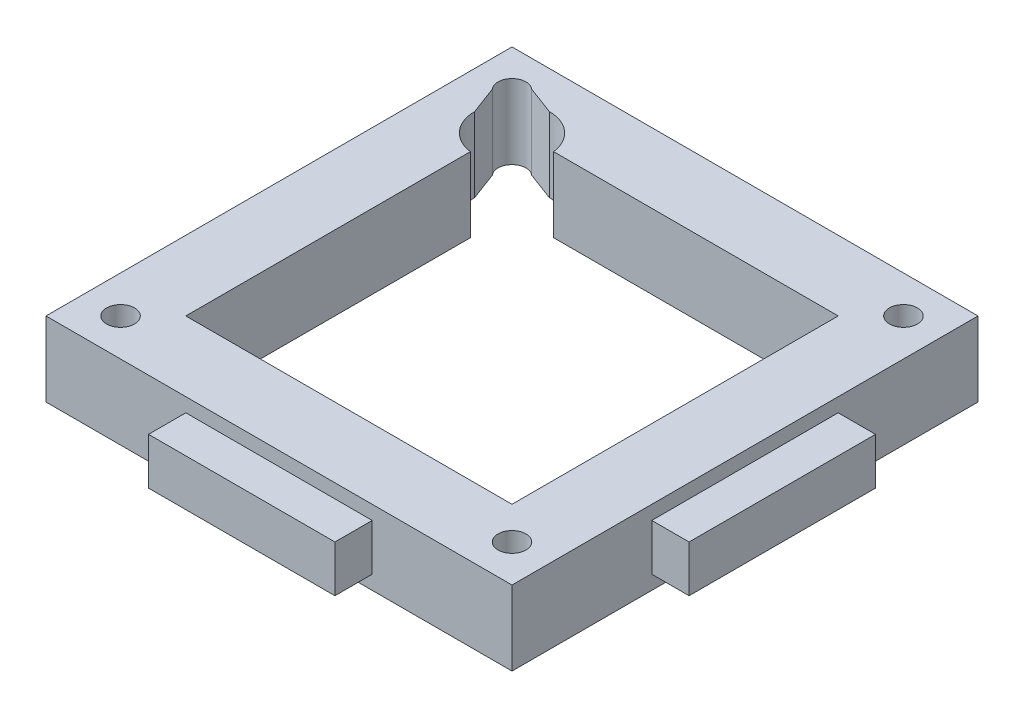
ISO-10303-21;
HEADER;
FILE_DESCRIPTION(('STEP AP214'),'2;1');
FILE_NAME('part.step','',(''),(''),'','','');
FILE_SCHEMA(('AUTOMOTIVE_DESIGN { 1 0 10303 214 1 1 1 1 }'));
ENDSEC;
DATA;
#1=APPLICATION_CONTEXT('core data for automotive mechanical design processes');
#2=APPLICATION_PROTOCOL_DEFINITION('international standard','automotive_design',2000,#1);
#3=PRODUCT_CONTEXT('',#1,'mechanical');
#4=PRODUCT('Part','Part','',(#3));
#5=PRODUCT_RELATED_PRODUCT_CATEGORY('part','',(#4));
#6=PRODUCT_DEFINITION_FORMATION('','',#4);
#7=PRODUCT_DEFINITION_CONTEXT('part definition',#1,'design');
#8=PRODUCT_DEFINITION('design','',#6,#7);
#9=PRODUCT_DEFINITION_SHAPE('','',#8);
#10=(LENGTH_UNIT() NAMED_UNIT(*) SI_UNIT(.MILLI.,.METRE.));
#11=(NAMED_UNIT(*) PLANE_ANGLE_UNIT() SI_UNIT($,.RADIAN.));
#12=(NAMED_UNIT(*) SI_UNIT($,.STERADIAN.) SOLID_ANGLE_UNIT());
#13=UNCERTAINTY_MEASURE_WITH_UNIT(LENGTH_MEASURE(1.E-05),#10,'distance_accuracy_value','');
#14=(GEOMETRIC_REPRESENTATION_CONTEXT(3) GLOBAL_UNCERTAINTY_ASSIGNED_CONTEXT((#13)) GLOBAL_UNIT_ASSIGNED_CONTEXT((#10,
#11,#12)) REPRESENTATION_CONTEXT('',''));
#15=CARTESIAN_POINT('',(0.,0.,0.));
#16=DIRECTION('',(0.,0.,1.));
#17=DIRECTION('',(1.,0.,0.));
#18=AXIS2_PLACEMENT_3D('',#15,#16,#17);
#19=CARTESIAN_POINT('',(25.,8.,0.));
#20=DIRECTION('',(-1.,0.,0.));
#21=DIRECTION('',(0.,0.,1.));
#22=AXIS2_PLACEMENT_3D('',#19,#20,#21);
#23=PLANE('',#22);
#24=DIRECTION('',(0.,0.,-1.));
#25=VECTOR('',#24,1.);
#26=CARTESIAN_POINT('',(25.,0.,0.));
#27=LINE('',#26,#25);
#28=CARTESIAN_POINT('',(25.,0.,25.));
#29=VERTEX_POINT('',#28);
#30=CARTESIAN_POINT('',(25.,0.,-25.));
#31=VERTEX_POINT('',#30);
#32=EDGE_CURVE('E457',#29,#31,#27,.T.);
#33=ORIENTED_EDGE('',*,*,#32,.T.);
#34=DIRECTION('',(0.,-1.,0.));
#35=VECTOR('',#34,1.);
#36=CARTESIAN_POINT('',(25.,8.,-25.));
#37=LINE('',#36,#35);
#38=CARTESIAN_POINT('',(25.,8.,-25.));
#39=VERTEX_POINT('',#38);
#40=EDGE_CURVE('E59',#39,#31,#37,.T.);
#41=ORIENTED_EDGE('',*,*,#40,.F.);
#42=DIRECTION('',(0.,0.,-1.));
#43=VECTOR('',#42,1.);
#44=CARTESIAN_POINT('',(25.,8.,0.));
#45=LINE('',#44,#43);
#46=CARTESIAN_POINT('',(25.,8.,25.));
#47=VERTEX_POINT('',#46);
#48=EDGE_CURVE('E397',#47,#39,#45,.T.);
#49=ORIENTED_EDGE('',*,*,#48,.F.);
#50=DIRECTION('',(0.,-1.,0.));
#51=VECTOR('',#50,1.);
#52=CARTESIAN_POINT('',(25.,8.,25.));
#53=LINE('',#52,#51);
#54=EDGE_CURVE('E11',#47,#29,#53,.T.);
#55=ORIENTED_EDGE('',*,*,#54,.T.);
#56=EDGE_LOOP('',(#33,#41,#49,#55));
#57=FACE_BOUND('',#56,.T.);
#58=DIRECTION('',(0.,0.,-1.));
#59=VECTOR('',#58,1.);
#60=CARTESIAN_POINT('',(25.,1.50000000000004,0.));
#61=LINE('',#60,#59);
#62=CARTESIAN_POINT('',(25.,1.5,10.));
#63=VERTEX_POINT('',#62);
#64=CARTESIAN_POINT('',(25.,1.50000000000007,-10.));
#65=VERTEX_POINT('',#64);
#66=EDGE_CURVE('E75',#63,#65,#61,.T.);
#67=ORIENTED_EDGE('',*,*,#66,.F.);
#68=DIRECTION('',(0.,-1.,0.));
#69=VECTOR('',#68,1.);
#70=CARTESIAN_POINT('',(25.,8.,10.));
#71=LINE('',#70,#69);
#72=CARTESIAN_POINT('',(25.,6.5,10.));
#73=VERTEX_POINT('',#72);
#74=EDGE_CURVE('E274',#73,#63,#71,.T.);
#75=ORIENTED_EDGE('',*,*,#74,.F.);
#76=DIRECTION('',(0.,0.,1.));
#77=VECTOR('',#76,1.);
#78=CARTESIAN_POINT('',(25.,6.5,0.));
#79=LINE('',#78,#77);
#80=CARTESIAN_POINT('',(25.,6.5,-10.));
#81=VERTEX_POINT('',#80);
#82=EDGE_CURVE('E290',#81,#73,#79,.T.);
#83=ORIENTED_EDGE('',*,*,#82,.F.);
#84=DIRECTION('',(0.,1.,0.));
#85=VECTOR('',#84,1.);
#86=CARTESIAN_POINT('',(25.,8.,-10.));
#87=LINE('',#86,#85);
#88=EDGE_CURVE('E286',#65,#81,#87,.T.);
#89=ORIENTED_EDGE('',*,*,#88,.F.);
#90=EDGE_LOOP('',(#67,#75,#83,#89));
#91=FACE_BOUND('',#90,.T.);
#92=ADVANCED_FACE('F49',(#57,#91),#23,.F.);
#93=CARTESIAN_POINT('',(0.,8.,25.));
#94=DIRECTION('',(0.,0.,-1.));
#95=DIRECTION('',(-1.,0.,0.));
#96=AXIS2_PLACEMENT_3D('',#93,#94,#95);
#97=PLANE('',#96);
#98=DIRECTION('',(1.,0.,0.));
#99=VECTOR('',#98,1.);
#100=CARTESIAN_POINT('',(0.,0.,25.));
#101=LINE('',#100,#99);
#102=CARTESIAN_POINT('',(-25.,0.,25.));
#103=VERTEX_POINT('',#102);
#104=EDGE_CURVE('E453',#103,#29,#101,.T.);
#105=ORIENTED_EDGE('',*,*,#104,.T.);
#106=ORIENTED_EDGE('',*,*,#54,.F.);
#107=DIRECTION('',(1.,0.,0.));
#108=VECTOR('',#107,1.);
#109=CARTESIAN_POINT('',(0.,8.,25.));
#110=LINE('',#109,#108);
#111=CARTESIAN_POINT('',(-25.,8.,25.));
#112=VERTEX_POINT('',#111);
#113=EDGE_CURVE('E393',#112,#47,#110,.T.);
#114=ORIENTED_EDGE('',*,*,#113,.F.);
#115=DIRECTION('',(0.,-1.,0.));
#116=VECTOR('',#115,1.);
#117=CARTESIAN_POINT('',(-25.,8.,25.));
#118=LINE('',#117,#116);
#119=EDGE_CURVE('E476',#112,#103,#118,.T.);
#120=ORIENTED_EDGE('',*,*,#119,.T.);
#121=EDGE_LOOP('',(#105,#106,#114,#120));
#122=FACE_BOUND('',#121,.T.);
#123=DIRECTION('',(1.,0.,0.));
#124=VECTOR('',#123,1.);
#125=CARTESIAN_POINT('',(0.,1.5000000000053,25.));
#126=LINE('',#125,#124);
#127=CARTESIAN_POINT('',(-10.0000000000553,1.5000000000053,25.));
#128=VERTEX_POINT('',#127);
#129=CARTESIAN_POINT('',(9.9999999999447,1.5000000000053,25.));
#130=VERTEX_POINT('',#129);
#131=EDGE_CURVE('E311',#128,#130,#126,.T.);
#132=ORIENTED_EDGE('',*,*,#131,.F.);
#133=DIRECTION('',(0.,-1.,0.));
#134=VECTOR('',#133,1.);
#135=CARTESIAN_POINT('',(-10.0000000000553,8.,25.));
#136=LINE('',#135,#134);
#137=CARTESIAN_POINT('',(-10.0000000000553,6.5000000000053,25.));
#138=VERTEX_POINT('',#137);
#139=EDGE_CURVE('E317',#138,#128,#136,.T.);
#140=ORIENTED_EDGE('',*,*,#139,.F.);
#141=DIRECTION('',(-1.,0.,0.));
#142=VECTOR('',#141,1.);
#143=CARTESIAN_POINT('',(0.,6.5000000000053,25.));
#144=LINE('',#143,#142);
#145=CARTESIAN_POINT('',(9.9999999999447,6.5000000000053,25.));
#146=VERTEX_POINT('',#145);
#147=EDGE_CURVE('E334',#146,#138,#144,.T.);
#148=ORIENTED_EDGE('',*,*,#147,.F.);
#149=DIRECTION('',(0.,1.,0.));
#150=VECTOR('',#149,1.);
#151=CARTESIAN_POINT('',(9.9999999999447,8.,25.));
#152=LINE('',#151,#150);
#153=EDGE_CURVE('E330',#130,#146,#152,.T.);
#154=ORIENTED_EDGE('',*,*,#153,.F.);
#155=EDGE_LOOP('',(#132,#140,#148,#154));
#156=FACE_BOUND('',#155,.T.);
#157=ADVANCED_FACE('F564',(#122,#156),#97,.F.);
#158=CARTESIAN_POINT('',(0.,8.,-25.));
#159=DIRECTION('',(0.,0.,-1.));
#160=DIRECTION('',(-1.,0.,0.));
#161=AXIS2_PLACEMENT_3D('',#158,#159,#160);
#162=PLANE('',#161);
#163=DIRECTION('',(1.,0.,0.));
#164=VECTOR('',#163,1.);
#165=CARTESIAN_POINT('',(0.,0.,-25.));
#166=LINE('',#165,#164);
#167=CARTESIAN_POINT('',(-25.,0.,-25.));
#168=VERTEX_POINT('',#167);
#169=EDGE_CURVE('E461',#168,#31,#166,.T.);
#170=ORIENTED_EDGE('',*,*,#169,.F.);
#171=DIRECTION('',(0.,-1.,0.));
#172=VECTOR('',#171,1.);
#173=CARTESIAN_POINT('',(-25.,8.,-25.));
#174=LINE('',#173,#172);
#175=CARTESIAN_POINT('',(-25.,8.,-25.));
#176=VERTEX_POINT('',#175);
#177=EDGE_CURVE('E479',#176,#168,#174,.T.);
#178=ORIENTED_EDGE('',*,*,#177,.F.);
#179=DIRECTION('',(1.,0.,0.));
#180=VECTOR('',#179,1.);
#181=CARTESIAN_POINT('',(0.,8.,-25.));
#182=LINE('',#181,#180);
#183=EDGE_CURVE('E400',#176,#39,#182,.T.);
#184=ORIENTED_EDGE('',*,*,#183,.T.);
#185=ORIENTED_EDGE('',*,*,#40,.T.);
#186=EDGE_LOOP('',(#170,#178,#184,#185));
#187=FACE_BOUND('',#186,.T.);
#188=ADVANCED_FACE('F562',(#187),#162,.T.);
#189=CARTESIAN_POINT('',(-17.,8.,-17.));
#190=DIRECTION('',(0.,-1.,0.));
#191=DIRECTION('',(0.,0.,-1.));
#192=AXIS2_PLACEMENT_3D('',#189,#190,#191);
#193=CYLINDRICAL_SURFACE('',#192,4.);
#194=CARTESIAN_POINT('',(-17.,0.,-17.));
#195=DIRECTION('',(0.,1.,0.));
#196=DIRECTION('',(0.,0.,1.));
#197=AXIS2_PLACEMENT_3D('',#194,#195,#196);
#198=CIRCLE('',#197,4.);
#199=CARTESIAN_POINT('',(-13.0313730334031,0.,-17.5));
#200=VERTEX_POINT('',#199);
#201=CARTESIAN_POINT('',(-17.,0.,-21.));
#202=VERTEX_POINT('',#201);
#203=EDGE_CURVE('E356',#200,#202,#198,.T.);
#204=ORIENTED_EDGE('',*,*,#203,.F.);
#205=DIRECTION('',(0.,-1.,0.));
#206=VECTOR('',#205,1.);
#207=CARTESIAN_POINT('',(-13.0313730334031,8.,-17.5));
#208=LINE('',#207,#206);
#209=CARTESIAN_POINT('',(-13.0313730334031,8.,-17.5));
#210=VERTEX_POINT('',#209);
#211=EDGE_CURVE('E53',#210,#200,#208,.T.);
#212=ORIENTED_EDGE('',*,*,#211,.F.);
#213=CARTESIAN_POINT('',(-17.,8.,-17.));
#214=DIRECTION('',(0.,1.,0.));
#215=DIRECTION('',(0.,0.,1.));
#216=AXIS2_PLACEMENT_3D('',#213,#214,#215);
#217=CIRCLE('',#216,4.);
#218=CARTESIAN_POINT('',(-17.,8.,-21.));
#219=VERTEX_POINT('',#218);
#220=EDGE_CURVE('E357',#210,#219,#217,.T.);
#221=ORIENTED_EDGE('',*,*,#220,.T.);
#222=DIRECTION('',(0.,-1.,0.));
#223=VECTOR('',#222,1.);
#224=CARTESIAN_POINT('',(-17.,8.,-21.));
#225=LINE('',#224,#223);
#226=EDGE_CURVE('E416',#219,#202,#225,.T.);
#227=ORIENTED_EDGE('',*,*,#226,.T.);
#228=EDGE_LOOP('',(#204,#212,#221,#227));
#229=FACE_BOUND('',#228,.T.);
#230=ADVANCED_FACE('F514',(#229),#193,.F.);
#231=CARTESIAN_POINT('',(0.,8.,-17.5));
#232=DIRECTION('',(0.,0.,1.));
#233=DIRECTION('',(1.,0.,0.));
#234=AXIS2_PLACEMENT_3D('',#231,#232,#233);
#235=PLANE('',#234);
#236=DIRECTION('',(-1.,0.,0.));
#237=VECTOR('',#236,1.);
#238=CARTESIAN_POINT('',(0.,0.,-17.5));
#239=LINE('',#238,#237);
#240=CARTESIAN_POINT('',(17.5,0.,-17.5));
#241=VERTEX_POINT('',#240);
#242=EDGE_CURVE('E420',#241,#200,#239,.T.);
#243=ORIENTED_EDGE('',*,*,#242,.F.);
#244=DIRECTION('',(0.,-1.,0.));
#245=VECTOR('',#244,1.);
#246=CARTESIAN_POINT('',(17.5,8.,-17.5));
#247=LINE('',#246,#245);
#248=CARTESIAN_POINT('',(17.5,8.,-17.5));
#249=VERTEX_POINT('',#248);
#250=EDGE_CURVE('E503',#249,#241,#247,.T.);
#251=ORIENTED_EDGE('',*,*,#250,.F.);
#252=DIRECTION('',(-1.,0.,0.));
#253=VECTOR('',#252,1.);
#254=CARTESIAN_POINT('',(0.,8.,-17.5));
#255=LINE('',#254,#253);
#256=EDGE_CURVE('E361',#249,#210,#255,.T.);
#257=ORIENTED_EDGE('',*,*,#256,.T.);
#258=ORIENTED_EDGE('',*,*,#211,.T.);
#259=EDGE_LOOP('',(#243,#251,#257,#258));
#260=FACE_BOUND('',#259,.T.);
#261=ADVANCED_FACE('F51',(#260),#235,.T.);
#262=CARTESIAN_POINT('',(17.5,8.,0.));
#263=DIRECTION('',(-1.,0.,0.));
#264=DIRECTION('',(0.,0.,1.));
#265=AXIS2_PLACEMENT_3D('',#262,#263,#264);
#266=PLANE('',#265);
#267=DIRECTION('',(0.,0.,-1.));
#268=VECTOR('',#267,1.);
#269=CARTESIAN_POINT('',(17.5,0.,0.));
#270=LINE('',#269,#268);
#271=CARTESIAN_POINT('',(17.5,0.,17.5));
#272=VERTEX_POINT('',#271);
#273=EDGE_CURVE('E425',#272,#241,#270,.T.);
#274=ORIENTED_EDGE('',*,*,#273,.F.);
#275=DIRECTION('',(0.,-1.,0.));
#276=VECTOR('',#275,1.);
#277=CARTESIAN_POINT('',(17.5,8.,17.5));
#278=LINE('',#277,#276);
#279=CARTESIAN_POINT('',(17.5,8.,17.5));
#280=VERTEX_POINT('',#279);
#281=EDGE_CURVE('E501',#280,#272,#278,.T.);
#282=ORIENTED_EDGE('',*,*,#281,.F.);
#283=DIRECTION('',(0.,0.,-1.));
#284=VECTOR('',#283,1.);
#285=CARTESIAN_POINT('',(17.5,8.,0.));
#286=LINE('',#285,#284);
#287=EDGE_CURVE('E367',#280,#249,#286,.T.);
#288=ORIENTED_EDGE('',*,*,#287,.T.);
#289=ORIENTED_EDGE('',*,*,#250,.T.);
#290=EDGE_LOOP('',(#274,#282,#288,#289));
#291=FACE_BOUND('',#290,.T.);
#292=ADVANCED_FACE('F522',(#291),#266,.T.);
#293=CARTESIAN_POINT('',(0.,8.,17.5));
#294=DIRECTION('',(0.,0.,-1.));
#295=DIRECTION('',(-1.,0.,0.));
#296=AXIS2_PLACEMENT_3D('',#293,#294,#295);
#297=PLANE('',#296);
#298=DIRECTION('',(1.,0.,0.));
#299=VECTOR('',#298,1.);
#300=CARTESIAN_POINT('',(0.,0.,17.5));
#301=LINE('',#300,#299);
#302=CARTESIAN_POINT('',(-17.5,0.,17.5));
#303=VERTEX_POINT('',#302);
#304=EDGE_CURVE('E429',#303,#272,#301,.T.);
#305=ORIENTED_EDGE('',*,*,#304,.F.);
#306=DIRECTION('',(0.,-1.,0.));
#307=VECTOR('',#306,1.);
#308=CARTESIAN_POINT('',(-17.5,8.,17.5));
#309=LINE('',#308,#307);
#310=CARTESIAN_POINT('',(-17.5,8.,17.5));
#311=VERTEX_POINT('',#310);
#312=EDGE_CURVE('E498',#311,#303,#309,.T.);
#313=ORIENTED_EDGE('',*,*,#312,.F.);
#314=DIRECTION('',(1.,0.,0.));
#315=VECTOR('',#314,1.);
#316=CARTESIAN_POINT('',(0.,8.,17.5));
#317=LINE('',#316,#315);
#318=EDGE_CURVE('E371',#311,#280,#317,.T.);
#319=ORIENTED_EDGE('',*,*,#318,.T.);
#320=ORIENTED_EDGE('',*,*,#281,.T.);
#321=EDGE_LOOP('',(#305,#313,#319,#320));
#322=FACE_BOUND('',#321,.T.);
#323=ADVANCED_FACE('F529',(#322),#297,.T.);
#324=CARTESIAN_POINT('',(-17.5,8.,0.));
#325=DIRECTION('',(-1.,0.,0.));
#326=DIRECTION('',(0.,0.,1.));
#327=AXIS2_PLACEMENT_3D('',#324,#325,#326);
#328=PLANE('',#327);
#329=DIRECTION('',(0.,0.,-1.));
#330=VECTOR('',#329,1.);
#331=CARTESIAN_POINT('',(-17.5,0.,0.));
#332=LINE('',#331,#330);
#333=CARTESIAN_POINT('',(-17.5,0.,-13.0313730334031));
#334=VERTEX_POINT('',#333);
#335=EDGE_CURVE('E433',#303,#334,#332,.T.);
#336=ORIENTED_EDGE('',*,*,#335,.T.);
#337=DIRECTION('',(0.,-1.,0.));
#338=VECTOR('',#337,1.);
#339=CARTESIAN_POINT('',(-17.5,8.,-13.0313730334031));
#340=LINE('',#339,#338);
#341=CARTESIAN_POINT('',(-17.5,8.,-13.0313730334031));
#342=VERTEX_POINT('',#341);
#343=EDGE_CURVE('E495',#342,#334,#340,.T.);
#344=ORIENTED_EDGE('',*,*,#343,.F.);
#345=DIRECTION('',(0.,0.,-1.));
#346=VECTOR('',#345,1.);
#347=CARTESIAN_POINT('',(-17.5,8.,0.));
#348=LINE('',#347,#346);
#349=EDGE_CURVE('E375',#311,#342,#348,.T.);
#350=ORIENTED_EDGE('',*,*,#349,.F.);
#351=ORIENTED_EDGE('',*,*,#312,.T.);
#352=EDGE_LOOP('',(#336,#344,#350,#351));
#353=FACE_BOUND('',#352,.T.);
#354=ADVANCED_FACE('F533',(#353),#328,.F.);
#355=CARTESIAN_POINT('',(-21.,0.,-17.));
#356=VERTEX_POINT('',#355);
#357=EDGE_CURVE('E421',#356,#334,#198,.T.);
#358=ORIENTED_EDGE('',*,*,#357,.F.);
#359=DIRECTION('',(0.,-1.,0.));
#360=VECTOR('',#359,1.);
#361=CARTESIAN_POINT('',(-21.,8.,-17.));
#362=LINE('',#361,#360);
#363=CARTESIAN_POINT('',(-21.,8.,-17.));
#364=VERTEX_POINT('',#363);
#365=EDGE_CURVE('E492',#364,#356,#362,.T.);
#366=ORIENTED_EDGE('',*,*,#365,.F.);
#367=EDGE_CURVE('E363',#364,#342,#217,.T.);
#368=ORIENTED_EDGE('',*,*,#367,.T.);
#369=ORIENTED_EDGE('',*,*,#343,.T.);
#370=EDGE_LOOP('',(#358,#366,#368,#369));
#371=FACE_BOUND('',#370,.T.);
#372=ADVANCED_FACE('F552',(#371),#193,.F.);
#373=CARTESIAN_POINT('',(-12.8219178082192,8.,4.80821917808219));
#374=DIRECTION('',(0.936329177569045,0.,-0.351123441588392));
#375=DIRECTION('',(-0.351123441588392,0.,-0.936329177569045));
#376=AXIS2_PLACEMENT_3D('',#373,#374,#375);
#377=PLANE('',#376);
#378=DIRECTION('',(0.351123441588392,0.,0.936329177569044));
#379=VECTOR('',#378,1.);
#380=CARTESIAN_POINT('',(-12.8219178082192,0.,4.80821917808219));
#381=LINE('',#380,#379);
#382=CARTESIAN_POINT('',(-22.1301369863014,0.,-20.013698630137));
#383=VERTEX_POINT('',#382);
#384=EDGE_CURVE('E437',#383,#356,#381,.T.);
#385=ORIENTED_EDGE('',*,*,#384,.F.);
#386=DIRECTION('',(0.,-1.,0.));
#387=VECTOR('',#386,1.);
#388=CARTESIAN_POINT('',(-22.1301369863014,8.,-20.013698630137));
#389=LINE('',#388,#387);
#390=CARTESIAN_POINT('',(-22.1301369863014,8.,-20.013698630137));
#391=VERTEX_POINT('',#390);
#392=EDGE_CURVE('E489',#391,#383,#389,.T.);
#393=ORIENTED_EDGE('',*,*,#392,.F.);
#394=DIRECTION('',(0.351123441588392,0.,0.936329177569044));
#395=VECTOR('',#394,1.);
#396=CARTESIAN_POINT('',(-12.8219178082192,8.,4.80821917808219));
#397=LINE('',#396,#395);
#398=EDGE_CURVE('E378',#391,#364,#397,.T.);
#399=ORIENTED_EDGE('',*,*,#398,.T.);
#400=ORIENTED_EDGE('',*,*,#365,.T.);
#401=EDGE_LOOP('',(#385,#393,#399,#400));
#402=FACE_BOUND('',#401,.T.);
#403=ADVANCED_FACE('F542',(#402),#377,.T.);
#404=CARTESIAN_POINT('',(-21.,8.,-21.));
#405=DIRECTION('',(0.,-1.,0.));
#406=DIRECTION('',(0.,0.,-1.));
#407=AXIS2_PLACEMENT_3D('',#404,#405,#406);
#408=CYLINDRICAL_SURFACE('',#407,1.5);
#409=CARTESIAN_POINT('',(-21.,0.,-21.));
#410=DIRECTION('',(0.,1.,0.));
#411=DIRECTION('',(0.,0.,1.));
#412=AXIS2_PLACEMENT_3D('',#409,#410,#411);
#413=CIRCLE('',#412,1.5);
#414=CARTESIAN_POINT('',(-20.013698630137,0.,-22.1301369863014));
#415=VERTEX_POINT('',#414);
#416=EDGE_CURVE('E441',#415,#383,#413,.T.);
#417=ORIENTED_EDGE('',*,*,#416,.F.);
#418=DIRECTION('',(0.,-1.,0.));
#419=VECTOR('',#418,1.);
#420=CARTESIAN_POINT('',(-20.013698630137,8.,-22.1301369863014));
#421=LINE('',#420,#419);
#422=CARTESIAN_POINT('',(-20.013698630137,8.,-22.1301369863014));
#423=VERTEX_POINT('',#422);
#424=EDGE_CURVE('E486',#423,#415,#421,.T.);
#425=ORIENTED_EDGE('',*,*,#424,.F.);
#426=CARTESIAN_POINT('',(-21.,8.,-21.));
#427=DIRECTION('',(0.,1.,0.));
#428=DIRECTION('',(0.,0.,1.));
#429=AXIS2_PLACEMENT_3D('',#426,#427,#428);
#430=CIRCLE('',#429,1.5);
#431=EDGE_CURVE('E382',#423,#391,#430,.T.);
#432=ORIENTED_EDGE('',*,*,#431,.T.);
#433=ORIENTED_EDGE('',*,*,#392,.T.);
#434=EDGE_LOOP('',(#417,#425,#432,#433));
#435=FACE_BOUND('',#434,.T.);
#436=ADVANCED_FACE('F546',(#435),#408,.F.);
#437=CARTESIAN_POINT('',(21.,8.,21.));
#438=DIRECTION('',(0.,-1.,0.));
#439=DIRECTION('',(0.,0.,-1.));
#440=AXIS2_PLACEMENT_3D('',#437,#438,#439);
#441=CYLINDRICAL_SURFACE('',#440,1.5);
#442=CARTESIAN_POINT('',(21.,8.,21.));
#443=DIRECTION('',(0.,1.,0.));
#444=DIRECTION('',(0.,0.,1.));
#445=AXIS2_PLACEMENT_3D('',#442,#443,#444);
#446=CIRCLE('',#445,1.5);
#447=CARTESIAN_POINT('',(21.,8.,22.5));
#448=VERTEX_POINT('',#447);
#449=EDGE_CURVE('E408',#448,#448,#446,.T.);
#450=ORIENTED_EDGE('',*,*,#449,.T.);
#451=EDGE_LOOP('',(#450));
#452=FACE_BOUND('',#451,.T.);
#453=CARTESIAN_POINT('',(21.,0.,21.));
#454=DIRECTION('',(0.,1.,0.));
#455=DIRECTION('',(0.,0.,1.));
#456=AXIS2_PLACEMENT_3D('',#453,#454,#455);
#457=CIRCLE('',#456,1.5);
#458=CARTESIAN_POINT('',(21.,0.,22.5));
#459=VERTEX_POINT('',#458);
#460=EDGE_CURVE('E469',#459,#459,#457,.T.);
#461=ORIENTED_EDGE('',*,*,#460,.F.);
#462=EDGE_LOOP('',(#461));
#463=FACE_BOUND('',#462,.T.);
#464=ADVANCED_FACE('F584',(#452,#463),#441,.F.);
#465=CARTESIAN_POINT('',(-25.,8.,0.));
#466=DIRECTION('',(-1.,0.,0.));
#467=DIRECTION('',(0.,0.,1.));
#468=AXIS2_PLACEMENT_3D('',#465,#466,#467);
#469=PLANE('',#468);
#470=DIRECTION('',(0.,0.,-1.));
#471=VECTOR('',#470,1.);
#472=CARTESIAN_POINT('',(-25.,6.5,0.));
#473=LINE('',#472,#471);
#474=CARTESIAN_POINT('',(-25.,6.5,10.));
#475=VERTEX_POINT('',#474);
#476=CARTESIAN_POINT('',(-25.,6.5,-10.));
#477=VERTEX_POINT('',#476);
#478=EDGE_CURVE('E67',#475,#477,#473,.T.);
#479=ORIENTED_EDGE('',*,*,#478,.F.);
#480=DIRECTION('',(0.,1.,0.));
#481=VECTOR('',#480,1.);
#482=CARTESIAN_POINT('',(-25.,8.,10.));
#483=LINE('',#482,#481);
#484=CARTESIAN_POINT('',(-25.,1.5,10.));
#485=VERTEX_POINT('',#484);
#486=EDGE_CURVE('E242',#485,#475,#483,.T.);
#487=ORIENTED_EDGE('',*,*,#486,.F.);
#488=DIRECTION('',(0.,0.,1.));
#489=VECTOR('',#488,1.);
#490=CARTESIAN_POINT('',(-25.,1.50000000000004,0.));
#491=LINE('',#490,#489);
#492=CARTESIAN_POINT('',(-25.,1.50000000000007,-10.));
#493=VERTEX_POINT('',#492);
#494=EDGE_CURVE('E246',#493,#485,#491,.T.);
#495=ORIENTED_EDGE('',*,*,#494,.F.);
#496=DIRECTION('',(0.,-1.,0.));
#497=VECTOR('',#496,1.);
#498=CARTESIAN_POINT('',(-25.,8.,-10.));
#499=LINE('',#498,#497);
#500=EDGE_CURVE('E255',#477,#493,#499,.T.);
#501=ORIENTED_EDGE('',*,*,#500,.F.);
#502=EDGE_LOOP('',(#479,#487,#495,#501));
#503=FACE_BOUND('',#502,.T.);
#504=DIRECTION('',(0.,0.,-1.));
#505=VECTOR('',#504,1.);
#506=CARTESIAN_POINT('',(-25.,0.,0.));
#507=LINE('',#506,#505);
#508=EDGE_CURVE('E465',#103,#168,#507,.T.);
#509=ORIENTED_EDGE('',*,*,#508,.F.);
#510=ORIENTED_EDGE('',*,*,#119,.F.);
#511=DIRECTION('',(0.,0.,-1.));
#512=VECTOR('',#511,1.);
#513=CARTESIAN_POINT('',(-25.,8.,0.));
#514=LINE('',#513,#512);
#515=EDGE_CURVE('E404',#112,#176,#514,.T.);
#516=ORIENTED_EDGE('',*,*,#515,.T.);
#517=ORIENTED_EDGE('',*,*,#177,.T.);
#518=EDGE_LOOP('',(#509,#510,#516,#517));
#519=FACE_BOUND('',#518,.T.);
#520=ADVANCED_FACE('F578',(#503,#519),#469,.T.);
#521=CARTESIAN_POINT('',(21.,8.,-21.));
#522=DIRECTION('',(0.,-1.,0.));
#523=DIRECTION('',(0.,0.,-1.));
#524=AXIS2_PLACEMENT_3D('',#521,#522,#523);
#525=CYLINDRICAL_SURFACE('',#524,1.5);
#526=CARTESIAN_POINT('',(21.,8.,-21.));
#527=DIRECTION('',(0.,1.,0.));
#528=DIRECTION('',(0.,0.,1.));
#529=AXIS2_PLACEMENT_3D('',#526,#527,#528);
#530=CIRCLE('',#529,1.5);
#531=CARTESIAN_POINT('',(21.,8.,-19.5));
#532=VERTEX_POINT('',#531);
#533=EDGE_CURVE('E389',#532,#532,#530,.F.);
#534=ORIENTED_EDGE('',*,*,#533,.F.);
#535=EDGE_LOOP('',(#534));
#536=FACE_BOUND('',#535,.T.);
#537=CARTESIAN_POINT('',(21.,0.,-21.));
#538=DIRECTION('',(0.,1.,0.));
#539=DIRECTION('',(0.,0.,1.));
#540=AXIS2_PLACEMENT_3D('',#537,#538,#539);
#541=CIRCLE('',#540,1.5);
#542=CARTESIAN_POINT('',(21.,0.,-19.5));
#543=VERTEX_POINT('',#542);
#544=EDGE_CURVE('E449',#543,#543,#541,.F.);
#545=ORIENTED_EDGE('',*,*,#544,.T.);
#546=EDGE_LOOP('',(#545));
#547=FACE_BOUND('',#546,.T.);
#548=ADVANCED_FACE('F575',(#536,#547),#525,.F.);
#549=CARTESIAN_POINT('',(4.80821917808219,8.,-12.8219178082192));
#550=DIRECTION('',(0.351123441588392,0.,-0.936329177569045));
#551=DIRECTION('',(-0.936329177569045,0.,-0.351123441588392));
#552=AXIS2_PLACEMENT_3D('',#549,#550,#551);
#553=PLANE('',#552);
#554=DIRECTION('',(0.936329177569044,0.,0.351123441588392));
#555=VECTOR('',#554,1.);
#556=CARTESIAN_POINT('',(4.80821917808219,0.,-12.8219178082192));
#557=LINE('',#556,#555);
#558=EDGE_CURVE('E445',#415,#202,#557,.T.);
#559=ORIENTED_EDGE('',*,*,#558,.T.);
#560=ORIENTED_EDGE('',*,*,#226,.F.);
#561=DIRECTION('',(0.936329177569044,0.,0.351123441588392));
#562=VECTOR('',#561,1.);
#563=CARTESIAN_POINT('',(4.80821917808219,8.,-12.8219178082192));
#564=LINE('',#563,#562);
#565=EDGE_CURVE('E386',#423,#219,#564,.T.);
#566=ORIENTED_EDGE('',*,*,#565,.F.);
#567=ORIENTED_EDGE('',*,*,#424,.T.);
#568=EDGE_LOOP('',(#559,#560,#566,#567));
#569=FACE_BOUND('',#568,.T.);
#570=ADVANCED_FACE('F549',(#569),#553,.F.);
#571=CARTESIAN_POINT('',(-21.,8.,21.));
#572=DIRECTION('',(0.,-1.,0.));
#573=DIRECTION('',(0.,0.,-1.));
#574=AXIS2_PLACEMENT_3D('',#571,#572,#573);
#575=CYLINDRICAL_SURFACE('',#574,1.5);
#576=CARTESIAN_POINT('',(-21.,8.,21.));
#577=DIRECTION('',(0.,1.,0.));
#578=DIRECTION('',(0.,0.,1.));
#579=AXIS2_PLACEMENT_3D('',#576,#577,#578);
#580=CIRCLE('',#579,1.5);
#581=CARTESIAN_POINT('',(-21.,8.,22.5));
#582=VERTEX_POINT('',#581);
#583=EDGE_CURVE('E412',#582,#582,#580,.F.);
#584=ORIENTED_EDGE('',*,*,#583,.F.);
#585=EDGE_LOOP('',(#584));
#586=FACE_BOUND('',#585,.T.);
#587=CARTESIAN_POINT('',(-21.,0.,21.));
#588=DIRECTION('',(0.,1.,0.));
#589=DIRECTION('',(0.,0.,1.));
#590=AXIS2_PLACEMENT_3D('',#587,#588,#589);
#591=CIRCLE('',#590,1.5);
#592=CARTESIAN_POINT('',(-21.,0.,22.5));
#593=VERTEX_POINT('',#592);
#594=EDGE_CURVE('E362',#593,#593,#591,.F.);
#595=ORIENTED_EDGE('',*,*,#594,.T.);
#596=EDGE_LOOP('',(#595));
#597=FACE_BOUND('',#596,.T.);
#598=ADVANCED_FACE('F582',(#586,#597),#575,.F.);
#599=CARTESIAN_POINT('',(0.,8.,0.));
#600=DIRECTION('',(0.,1.,0.));
#601=DIRECTION('',(0.,0.,1.));
#602=AXIS2_PLACEMENT_3D('',#599,#600,#601);
#603=PLANE('',#602);
#604=ORIENTED_EDGE('',*,*,#220,.F.);
#605=ORIENTED_EDGE('',*,*,#256,.F.);
#606=ORIENTED_EDGE('',*,*,#287,.F.);
#607=ORIENTED_EDGE('',*,*,#318,.F.);
#608=ORIENTED_EDGE('',*,*,#349,.T.);
#609=ORIENTED_EDGE('',*,*,#367,.F.);
#610=ORIENTED_EDGE('',*,*,#398,.F.);
#611=ORIENTED_EDGE('',*,*,#431,.F.);
#612=ORIENTED_EDGE('',*,*,#565,.T.);
#613=EDGE_LOOP('',(#604,#605,#606,#607,#608,#609,#610,#611,#612));
#614=FACE_BOUND('',#613,.T.);
#615=ORIENTED_EDGE('',*,*,#533,.T.);
#616=EDGE_LOOP('',(#615));
#617=FACE_BOUND('',#616,.T.);
#618=ORIENTED_EDGE('',*,*,#113,.T.);
#619=ORIENTED_EDGE('',*,*,#48,.T.);
#620=ORIENTED_EDGE('',*,*,#183,.F.);
#621=ORIENTED_EDGE('',*,*,#515,.F.);
#622=EDGE_LOOP('',(#618,#619,#620,#621));
#623=FACE_BOUND('',#622,.T.);
#624=ORIENTED_EDGE('',*,*,#449,.F.);
#625=EDGE_LOOP('',(#624));
#626=FACE_BOUND('',#625,.T.);
#627=ORIENTED_EDGE('',*,*,#583,.T.);
#628=EDGE_LOOP('',(#627));
#629=FACE_BOUND('',#628,.T.);
#630=ADVANCED_FACE('F527',(#614,#617,#623,#626,#629),#603,.T.);
#631=CARTESIAN_POINT('',(0.,0.,0.));
#632=DIRECTION('',(0.,1.,0.));
#633=DIRECTION('',(0.,0.,1.));
#634=AXIS2_PLACEMENT_3D('',#631,#632,#633);
#635=PLANE('',#634);
#636=ORIENTED_EDGE('',*,*,#203,.T.);
#637=ORIENTED_EDGE('',*,*,#558,.F.);
#638=ORIENTED_EDGE('',*,*,#416,.T.);
#639=ORIENTED_EDGE('',*,*,#384,.T.);
#640=ORIENTED_EDGE('',*,*,#357,.T.);
#641=ORIENTED_EDGE('',*,*,#335,.F.);
#642=ORIENTED_EDGE('',*,*,#304,.T.);
#643=ORIENTED_EDGE('',*,*,#273,.T.);
#644=ORIENTED_EDGE('',*,*,#242,.T.);
#645=EDGE_LOOP('',(#636,#637,#638,#639,#640,#641,#642,#643,#644));
#646=FACE_BOUND('',#645,.T.);
#647=ORIENTED_EDGE('',*,*,#544,.F.);
#648=EDGE_LOOP('',(#647));
#649=FACE_BOUND('',#648,.T.);
#650=ORIENTED_EDGE('',*,*,#104,.F.);
#651=ORIENTED_EDGE('',*,*,#508,.T.);
#652=ORIENTED_EDGE('',*,*,#169,.T.);
#653=ORIENTED_EDGE('',*,*,#32,.F.);
#654=EDGE_LOOP('',(#650,#651,#652,#653));
#655=FACE_BOUND('',#654,.T.);
#656=ORIENTED_EDGE('',*,*,#460,.T.);
#657=EDGE_LOOP('',(#656));
#658=FACE_BOUND('',#657,.T.);
#659=ORIENTED_EDGE('',*,*,#594,.F.);
#660=EDGE_LOOP('',(#659));
#661=FACE_BOUND('',#660,.T.);
#662=ADVANCED_FACE('F518',(#646,#649,#655,#658,#661),#635,.F.);
#663=CARTESIAN_POINT('',(0.,1.5000000000053,29.));
#664=DIRECTION('',(0.,1.,0.));
#665=DIRECTION('',(0.,0.,1.));
#666=AXIS2_PLACEMENT_3D('',#663,#664,#665);
#667=PLANE('',#666);
#668=ORIENTED_EDGE('',*,*,#131,.T.);
#669=DIRECTION('',(0.,0.,-1.));
#670=VECTOR('',#669,1.);
#671=CARTESIAN_POINT('',(9.9999999999447,1.5000000000053,29.));
#672=LINE('',#671,#670);
#673=CARTESIAN_POINT('',(9.9999999999447,1.5000000000053,29.));
#674=VERTEX_POINT('',#673);
#675=EDGE_CURVE('E352',#674,#130,#672,.T.);
#676=ORIENTED_EDGE('',*,*,#675,.F.);
#677=DIRECTION('',(1.,0.,0.));
#678=VECTOR('',#677,1.);
#679=CARTESIAN_POINT('',(0.,1.5000000000053,29.));
#680=LINE('',#679,#678);
#681=CARTESIAN_POINT('',(-10.0000000000553,1.5000000000053,29.));
#682=VERTEX_POINT('',#681);
#683=EDGE_CURVE('E312',#682,#674,#680,.T.);
#684=ORIENTED_EDGE('',*,*,#683,.F.);
#685=DIRECTION('',(0.,0.,-1.));
#686=VECTOR('',#685,1.);
#687=CARTESIAN_POINT('',(-10.0000000000553,1.5000000000053,29.));
#688=LINE('',#687,#686);
#689=EDGE_CURVE('E326',#682,#128,#688,.T.);
#690=ORIENTED_EDGE('',*,*,#689,.T.);
#691=EDGE_LOOP('',(#668,#676,#684,#690));
#692=FACE_BOUND('',#691,.T.);
#693=ADVANCED_FACE('F601',(#692),#667,.F.);
#694=CARTESIAN_POINT('',(9.9999999999447,8.,29.));
#695=DIRECTION('',(-1.,0.,0.));
#696=DIRECTION('',(0.,0.,1.));
#697=AXIS2_PLACEMENT_3D('',#694,#695,#696);
#698=PLANE('',#697);
#699=ORIENTED_EDGE('',*,*,#153,.T.);
#700=DIRECTION('',(0.,0.,-1.));
#701=VECTOR('',#700,1.);
#702=CARTESIAN_POINT('',(9.9999999999447,6.5000000000053,29.));
#703=LINE('',#702,#701);
#704=CARTESIAN_POINT('',(9.9999999999447,6.5000000000053,29.));
#705=VERTEX_POINT('',#704);
#706=EDGE_CURVE('E348',#705,#146,#703,.T.);
#707=ORIENTED_EDGE('',*,*,#706,.F.);
#708=DIRECTION('',(0.,1.,0.));
#709=VECTOR('',#708,1.);
#710=CARTESIAN_POINT('',(9.9999999999447,8.,29.));
#711=LINE('',#710,#709);
#712=EDGE_CURVE('E316',#674,#705,#711,.T.);
#713=ORIENTED_EDGE('',*,*,#712,.F.);
#714=ORIENTED_EDGE('',*,*,#675,.T.);
#715=EDGE_LOOP('',(#699,#707,#713,#714));
#716=FACE_BOUND('',#715,.T.);
#717=ADVANCED_FACE('F606',(#716),#698,.F.);
#718=CARTESIAN_POINT('',(0.,6.5000000000053,29.));
#719=DIRECTION('',(0.,-1.,0.));
#720=DIRECTION('',(0.,0.,-1.));
#721=AXIS2_PLACEMENT_3D('',#718,#719,#720);
#722=PLANE('',#721);
#723=ORIENTED_EDGE('',*,*,#147,.T.);
#724=DIRECTION('',(0.,0.,-1.));
#725=VECTOR('',#724,1.);
#726=CARTESIAN_POINT('',(-10.0000000000553,6.5000000000053,29.));
#727=LINE('',#726,#725);
#728=CARTESIAN_POINT('',(-10.0000000000553,6.5000000000053,29.));
#729=VERTEX_POINT('',#728);
#730=EDGE_CURVE('E344',#729,#138,#727,.T.);
#731=ORIENTED_EDGE('',*,*,#730,.F.);
#732=DIRECTION('',(-1.,0.,0.));
#733=VECTOR('',#732,1.);
#734=CARTESIAN_POINT('',(0.,6.5000000000053,29.));
#735=LINE('',#734,#733);
#736=EDGE_CURVE('E320',#705,#729,#735,.T.);
#737=ORIENTED_EDGE('',*,*,#736,.F.);
#738=ORIENTED_EDGE('',*,*,#706,.T.);
#739=EDGE_LOOP('',(#723,#731,#737,#738));
#740=FACE_BOUND('',#739,.T.);
#741=ADVANCED_FACE('F610',(#740),#722,.F.);
#742=CARTESIAN_POINT('',(-10.0000000000553,8.,29.));
#743=DIRECTION('',(1.,0.,0.));
#744=DIRECTION('',(0.,0.,-1.));
#745=AXIS2_PLACEMENT_3D('',#742,#743,#744);
#746=PLANE('',#745);
#747=ORIENTED_EDGE('',*,*,#139,.T.);
#748=ORIENTED_EDGE('',*,*,#689,.F.);
#749=DIRECTION('',(0.,-1.,0.));
#750=VECTOR('',#749,1.);
#751=CARTESIAN_POINT('',(-10.0000000000553,8.,29.));
#752=LINE('',#751,#750);
#753=EDGE_CURVE('E323',#729,#682,#752,.T.);
#754=ORIENTED_EDGE('',*,*,#753,.F.);
#755=ORIENTED_EDGE('',*,*,#730,.T.);
#756=EDGE_LOOP('',(#747,#748,#754,#755));
#757=FACE_BOUND('',#756,.T.);
#758=ADVANCED_FACE('F614',(#757),#746,.F.);
#759=CARTESIAN_POINT('',(0.,0.,29.));
#760=DIRECTION('',(0.,0.,1.));
#761=DIRECTION('',(1.,0.,0.));
#762=AXIS2_PLACEMENT_3D('',#759,#760,#761);
#763=PLANE('',#762);
#764=ORIENTED_EDGE('',*,*,#683,.T.);
#765=ORIENTED_EDGE('',*,*,#712,.T.);
#766=ORIENTED_EDGE('',*,*,#736,.T.);
#767=ORIENTED_EDGE('',*,*,#753,.T.);
#768=EDGE_LOOP('',(#764,#765,#766,#767));
#769=FACE_BOUND('',#768,.T.);
#770=ADVANCED_FACE('F618',(#769),#763,.T.);
#771=CARTESIAN_POINT('',(29.,1.50000000000004,0.));
#772=DIRECTION('',(0.,1.,0.));
#773=DIRECTION('',(0.,0.,1.));
#774=AXIS2_PLACEMENT_3D('',#771,#772,#773);
#775=PLANE('',#774);
#776=ORIENTED_EDGE('',*,*,#66,.T.);
#777=DIRECTION('',(-1.,0.,0.));
#778=VECTOR('',#777,1.);
#779=CARTESIAN_POINT('',(29.,1.50000000000007,-10.));
#780=LINE('',#779,#778);
#781=CARTESIAN_POINT('',(29.,1.50000000000007,-10.));
#782=VERTEX_POINT('',#781);
#783=EDGE_CURVE('E307',#782,#65,#780,.T.);
#784=ORIENTED_EDGE('',*,*,#783,.F.);
#785=DIRECTION('',(0.,0.,-1.));
#786=VECTOR('',#785,1.);
#787=CARTESIAN_POINT('',(29.,1.50000000000004,0.));
#788=LINE('',#787,#786);
#789=CARTESIAN_POINT('',(29.,1.5,10.));
#790=VERTEX_POINT('',#789);
#791=EDGE_CURVE('E269',#790,#782,#788,.T.);
#792=ORIENTED_EDGE('',*,*,#791,.F.);
#793=DIRECTION('',(-1.,0.,0.));
#794=VECTOR('',#793,1.);
#795=CARTESIAN_POINT('',(29.,1.5,10.));
#796=LINE('',#795,#794);
#797=EDGE_CURVE('E283',#790,#63,#796,.T.);
#798=ORIENTED_EDGE('',*,*,#797,.T.);
#799=EDGE_LOOP('',(#776,#784,#792,#798));
#800=FACE_BOUND('',#799,.T.);
#801=ADVANCED_FACE('F622',(#800),#775,.F.);
#802=CARTESIAN_POINT('',(29.,8.,-10.));
#803=DIRECTION('',(0.,0.,1.));
#804=DIRECTION('',(1.,0.,0.));
#805=AXIS2_PLACEMENT_3D('',#802,#803,#804);
#806=PLANE('',#805);
#807=ORIENTED_EDGE('',*,*,#88,.T.);
#808=DIRECTION('',(-1.,0.,0.));
#809=VECTOR('',#808,1.);
#810=CARTESIAN_POINT('',(29.,6.5,-10.));
#811=LINE('',#810,#809);
#812=CARTESIAN_POINT('',(29.,6.5,-10.));
#813=VERTEX_POINT('',#812);
#814=EDGE_CURVE('E303',#813,#81,#811,.T.);
#815=ORIENTED_EDGE('',*,*,#814,.F.);
#816=DIRECTION('',(0.,1.,0.));
#817=VECTOR('',#816,1.);
#818=CARTESIAN_POINT('',(29.,8.,-10.));
#819=LINE('',#818,#817);
#820=EDGE_CURVE('E273',#782,#813,#819,.T.);
#821=ORIENTED_EDGE('',*,*,#820,.F.);
#822=ORIENTED_EDGE('',*,*,#783,.T.);
#823=EDGE_LOOP('',(#807,#815,#821,#822));
#824=FACE_BOUND('',#823,.T.);
#825=ADVANCED_FACE('F626',(#824),#806,.F.);
#826=CARTESIAN_POINT('',(29.,6.5,0.));
#827=DIRECTION('',(0.,-1.,0.));
#828=DIRECTION('',(0.,0.,-1.));
#829=AXIS2_PLACEMENT_3D('',#826,#827,#828);
#830=PLANE('',#829);
#831=ORIENTED_EDGE('',*,*,#82,.T.);
#832=DIRECTION('',(-1.,0.,0.));
#833=VECTOR('',#832,1.);
#834=CARTESIAN_POINT('',(29.,6.5,10.));
#835=LINE('',#834,#833);
#836=CARTESIAN_POINT('',(29.,6.5,10.));
#837=VERTEX_POINT('',#836);
#838=EDGE_CURVE('E299',#837,#73,#835,.T.);
#839=ORIENTED_EDGE('',*,*,#838,.F.);
#840=DIRECTION('',(0.,0.,1.));
#841=VECTOR('',#840,1.);
#842=CARTESIAN_POINT('',(29.,6.5,0.));
#843=LINE('',#842,#841);
#844=EDGE_CURVE('E277',#813,#837,#843,.T.);
#845=ORIENTED_EDGE('',*,*,#844,.F.);
#846=ORIENTED_EDGE('',*,*,#814,.T.);
#847=EDGE_LOOP('',(#831,#839,#845,#846));
#848=FACE_BOUND('',#847,.T.);
#849=ADVANCED_FACE('F630',(#848),#830,.F.);
#850=CARTESIAN_POINT('',(29.,8.,10.));
#851=DIRECTION('',(0.,0.,-1.));
#852=DIRECTION('',(-1.,0.,0.));
#853=AXIS2_PLACEMENT_3D('',#850,#851,#852);
#854=PLANE('',#853);
#855=ORIENTED_EDGE('',*,*,#74,.T.);
#856=ORIENTED_EDGE('',*,*,#797,.F.);
#857=DIRECTION('',(0.,-1.,0.));
#858=VECTOR('',#857,1.);
#859=CARTESIAN_POINT('',(29.,8.,10.));
#860=LINE('',#859,#858);
#861=EDGE_CURVE('E280',#837,#790,#860,.T.);
#862=ORIENTED_EDGE('',*,*,#861,.F.);
#863=ORIENTED_EDGE('',*,*,#838,.T.);
#864=EDGE_LOOP('',(#855,#856,#862,#863));
#865=FACE_BOUND('',#864,.T.);
#866=ADVANCED_FACE('F634',(#865),#854,.F.);
#867=CARTESIAN_POINT('',(29.,0.,0.));
#868=DIRECTION('',(1.,0.,0.));
#869=DIRECTION('',(0.,0.,-1.));
#870=AXIS2_PLACEMENT_3D('',#867,#868,#869);
#871=PLANE('',#870);
#872=ORIENTED_EDGE('',*,*,#791,.T.);
#873=ORIENTED_EDGE('',*,*,#820,.T.);
#874=ORIENTED_EDGE('',*,*,#844,.T.);
#875=ORIENTED_EDGE('',*,*,#861,.T.);
#876=EDGE_LOOP('',(#872,#873,#874,#875));
#877=FACE_BOUND('',#876,.T.);
#878=ADVANCED_FACE('F638',(#877),#871,.T.);
#879=CARTESIAN_POINT('',(-21.,6.5,0.));
#880=DIRECTION('',(0.,1.,0.));
#881=DIRECTION('',(0.,0.,1.));
#882=AXIS2_PLACEMENT_3D('',#879,#880,#881);
#883=PLANE('',#882);
#884=ORIENTED_EDGE('',*,*,#478,.T.);
#885=DIRECTION('',(-1.,0.,0.));
#886=VECTOR('',#885,1.);
#887=CARTESIAN_POINT('',(-21.,6.5,-10.));
#888=LINE('',#887,#886);
#889=CARTESIAN_POINT('',(-21.,6.5,-10.));
#890=VERTEX_POINT('',#889);
#891=EDGE_CURVE('E217',#890,#477,#888,.T.);
#892=ORIENTED_EDGE('',*,*,#891,.F.);
#893=DIRECTION('',(0.,0.,-1.));
#894=VECTOR('',#893,1.);
#895=CARTESIAN_POINT('',(-21.,6.5,0.));
#896=LINE('',#895,#894);
#897=CARTESIAN_POINT('',(-21.,6.5,10.));
#898=VERTEX_POINT('',#897);
#899=EDGE_CURVE('E221',#898,#890,#896,.T.);
#900=ORIENTED_EDGE('',*,*,#899,.F.);
#901=DIRECTION('',(-1.,0.,0.));
#902=VECTOR('',#901,1.);
#903=CARTESIAN_POINT('',(-21.,6.5,10.));
#904=LINE('',#903,#902);
#905=EDGE_CURVE('E261',#898,#475,#904,.T.);
#906=ORIENTED_EDGE('',*,*,#905,.T.);
#907=EDGE_LOOP('',(#884,#892,#900,#906));
#908=FACE_BOUND('',#907,.T.);
#909=ADVANCED_FACE('F219',(#908),#883,.F.);
#910=CARTESIAN_POINT('',(-21.,8.,10.));
#911=DIRECTION('',(0.,0.,1.));
#912=DIRECTION('',(1.,0.,0.));
#913=AXIS2_PLACEMENT_3D('',#910,#911,#912);
#914=PLANE('',#913);
#915=ORIENTED_EDGE('',*,*,#486,.T.);
#916=ORIENTED_EDGE('',*,*,#905,.F.);
#917=DIRECTION('',(0.,1.,0.));
#918=VECTOR('',#917,1.);
#919=CARTESIAN_POINT('',(-21.,8.,10.));
#920=LINE('',#919,#918);
#921=CARTESIAN_POINT('',(-21.,1.5,10.));
#922=VERTEX_POINT('',#921);
#923=EDGE_CURVE('E228',#922,#898,#920,.T.);
#924=ORIENTED_EDGE('',*,*,#923,.F.);
#925=DIRECTION('',(-1.,0.,0.));
#926=VECTOR('',#925,1.);
#927=CARTESIAN_POINT('',(-21.,1.5,10.));
#928=LINE('',#927,#926);
#929=EDGE_CURVE('E264',#922,#485,#928,.T.);
#930=ORIENTED_EDGE('',*,*,#929,.T.);
#931=EDGE_LOOP('',(#915,#916,#924,#930));
#932=FACE_BOUND('',#931,.T.);
#933=ADVANCED_FACE('F645',(#932),#914,.F.);
#934=CARTESIAN_POINT('',(-21.,1.50000000000004,0.));
#935=DIRECTION('',(0.,-1.,0.));
#936=DIRECTION('',(0.,0.,-1.));
#937=AXIS2_PLACEMENT_3D('',#934,#935,#936);
#938=PLANE('',#937);
#939=ORIENTED_EDGE('',*,*,#494,.T.);
#940=ORIENTED_EDGE('',*,*,#929,.F.);
#941=DIRECTION('',(0.,0.,1.));
#942=VECTOR('',#941,1.);
#943=CARTESIAN_POINT('',(-21.,1.50000000000004,0.));
#944=LINE('',#943,#942);
#945=CARTESIAN_POINT('',(-21.,1.50000000000007,-10.));
#946=VERTEX_POINT('',#945);
#947=EDGE_CURVE('E237',#946,#922,#944,.T.);
#948=ORIENTED_EDGE('',*,*,#947,.F.);
#949=DIRECTION('',(-1.,0.,0.));
#950=VECTOR('',#949,1.);
#951=CARTESIAN_POINT('',(-21.,1.50000000000007,-10.));
#952=LINE('',#951,#950);
#953=EDGE_CURVE('E227',#946,#493,#952,.T.);
#954=ORIENTED_EDGE('',*,*,#953,.T.);
#955=EDGE_LOOP('',(#939,#940,#948,#954));
#956=FACE_BOUND('',#955,.T.);
#957=ADVANCED_FACE('F648',(#956),#938,.F.);
#958=CARTESIAN_POINT('',(-21.,8.,-10.));
#959=DIRECTION('',(0.,0.,-1.));
#960=DIRECTION('',(-1.,0.,0.));
#961=AXIS2_PLACEMENT_3D('',#958,#959,#960);
#962=PLANE('',#961);
#963=ORIENTED_EDGE('',*,*,#500,.T.);
#964=ORIENTED_EDGE('',*,*,#953,.F.);
#965=DIRECTION('',(0.,-1.,0.));
#966=VECTOR('',#965,1.);
#967=CARTESIAN_POINT('',(-21.,8.,-10.));
#968=LINE('',#967,#966);
#969=EDGE_CURVE('E231',#890,#946,#968,.T.);
#970=ORIENTED_EDGE('',*,*,#969,.F.);
#971=ORIENTED_EDGE('',*,*,#891,.T.);
#972=EDGE_LOOP('',(#963,#964,#970,#971));
#973=FACE_BOUND('',#972,.T.);
#974=ADVANCED_FACE('F232',(#973),#962,.F.);
#975=CARTESIAN_POINT('',(-21.,0.,0.));
#976=DIRECTION('',(-1.,0.,0.));
#977=DIRECTION('',(0.,0.,1.));
#978=AXIS2_PLACEMENT_3D('',#975,#976,#977);
#979=PLANE('',#978);
#980=ORIENTED_EDGE('',*,*,#899,.T.);
#981=ORIENTED_EDGE('',*,*,#969,.T.);
#982=ORIENTED_EDGE('',*,*,#947,.T.);
#983=ORIENTED_EDGE('',*,*,#923,.T.);
#984=EDGE_LOOP('',(#980,#981,#982,#983));
#985=FACE_BOUND('',#984,.T.);
#986=ADVANCED_FACE('F239',(#985),#979,.T.);
#987=CLOSED_SHELL('',(#92,#157,#188,#230,#261,#292,#323,#354,#372,#403,#436,#464,#520,#548,#570,
#598,#630,#662,#693,#717,#741,#758,#770,#801,#825,#849,#866,#878,#909,#933,#957,#974,#986));
#988=MANIFOLD_SOLID_BREP('B2',#987);
#989=ADVANCED_BREP_SHAPE_REPRESENTATION('',(#18,#988),#14);
#990=SHAPE_DEFINITION_REPRESENTATION(#9,#989);
ENDSEC;
END-ISO-10303-21;
